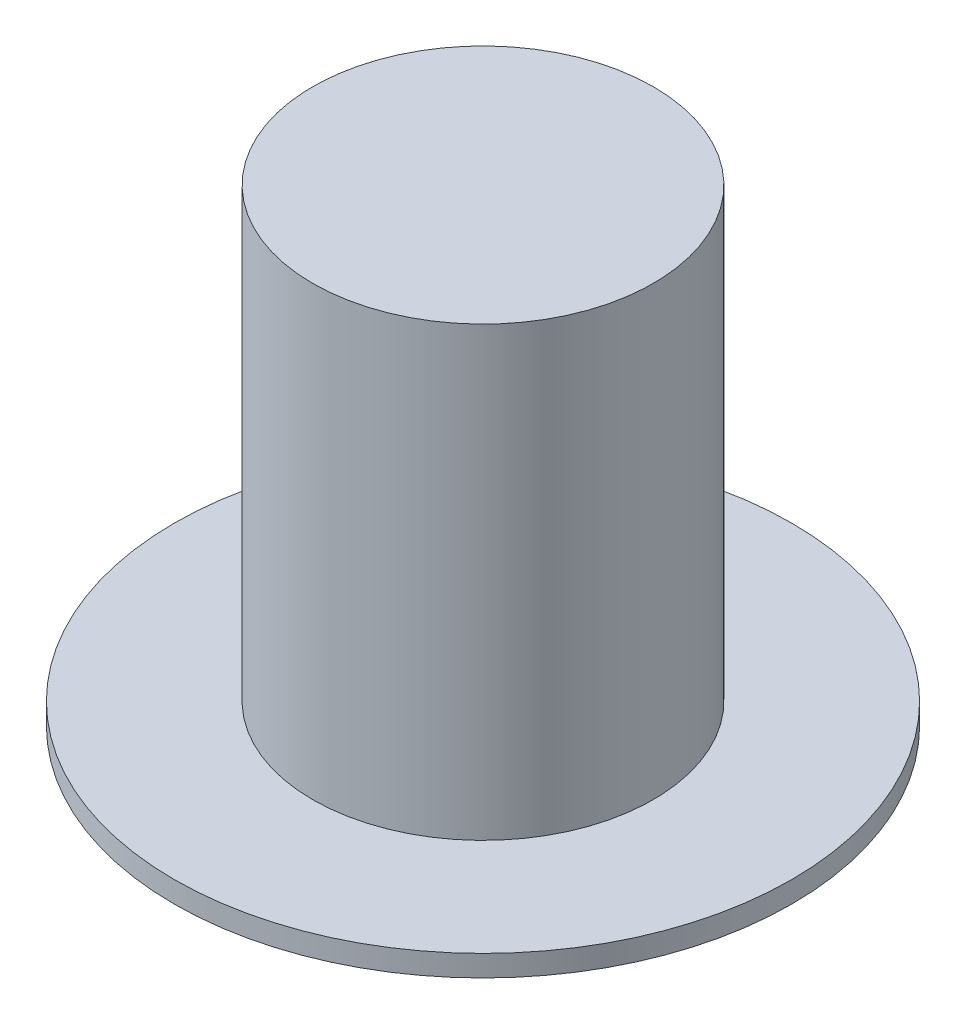
ISO-10303-21;
HEADER;
FILE_DESCRIPTION(('STEP AP214'),'2;1');
FILE_NAME('part.step','',(''),(''),'','','');
FILE_SCHEMA(('AUTOMOTIVE_DESIGN { 1 0 10303 214 1 1 1 1 }'));
ENDSEC;
DATA;
#1=APPLICATION_CONTEXT('core data for automotive mechanical design processes');
#2=APPLICATION_PROTOCOL_DEFINITION('international standard','automotive_design',2000,#1);
#3=PRODUCT_CONTEXT('',#1,'mechanical');
#4=PRODUCT('Part','Part','',(#3));
#5=PRODUCT_RELATED_PRODUCT_CATEGORY('part','',(#4));
#6=PRODUCT_DEFINITION_FORMATION('','',#4);
#7=PRODUCT_DEFINITION_CONTEXT('part definition',#1,'design');
#8=PRODUCT_DEFINITION('design','',#6,#7);
#9=PRODUCT_DEFINITION_SHAPE('','',#8);
#10=(LENGTH_UNIT() NAMED_UNIT(*) SI_UNIT(.MILLI.,.METRE.));
#11=(NAMED_UNIT(*) PLANE_ANGLE_UNIT() SI_UNIT($,.RADIAN.));
#12=(NAMED_UNIT(*) SI_UNIT($,.STERADIAN.) SOLID_ANGLE_UNIT());
#13=UNCERTAINTY_MEASURE_WITH_UNIT(LENGTH_MEASURE(1.E-05),#10,'distance_accuracy_value','');
#14=(GEOMETRIC_REPRESENTATION_CONTEXT(3) GLOBAL_UNCERTAINTY_ASSIGNED_CONTEXT((#13)) GLOBAL_UNIT_ASSIGNED_CONTEXT((#10,
#11,#12)) REPRESENTATION_CONTEXT('',''));
#15=CARTESIAN_POINT('',(0.,0.,0.));
#16=DIRECTION('',(0.,0.,1.));
#17=DIRECTION('',(1.,0.,0.));
#18=AXIS2_PLACEMENT_3D('',#15,#16,#17);
#19=CARTESIAN_POINT('',(-1.,10.,-6.5));
#20=DIRECTION('',(1.,0.,0.));
#21=DIRECTION('',(0.,0.,-1.));
#22=AXIS2_PLACEMENT_3D('',#19,#20,#21);
#23=PLANE('',#22);
#24=DIRECTION('',(0.,0.,1.));
#25=VECTOR('',#24,1.);
#26=CARTESIAN_POINT('',(-1.,10.,-6.5));
#27=LINE('',#26,#25);
#28=CARTESIAN_POINT('',(-1.,10.,-6.5));
#29=VERTEX_POINT('',#28);
#30=CARTESIAN_POINT('',(-1.,10.,-1.));
#31=VERTEX_POINT('',#30);
#32=EDGE_CURVE('E106',#29,#31,#27,.T.);
#33=ORIENTED_EDGE('',*,*,#32,.T.);
#34=DIRECTION('',(0.,1.,0.));
#35=VECTOR('',#34,1.);
#36=CARTESIAN_POINT('',(-1.,9.,-1.));
#37=LINE('',#36,#35);
#38=CARTESIAN_POINT('',(-1.,9.,-1.));
#39=VERTEX_POINT('',#38);
#40=EDGE_CURVE('E47',#39,#31,#37,.T.);
#41=ORIENTED_EDGE('',*,*,#40,.F.);
#42=DIRECTION('',(0.,0.,-1.));
#43=VECTOR('',#42,1.);
#44=CARTESIAN_POINT('',(-1.,9.,1.));
#45=LINE('',#44,#43);
#46=CARTESIAN_POINT('',(-0.999999999999999,9.,1.));
#47=VERTEX_POINT('',#46);
#48=EDGE_CURVE('E52',#47,#39,#45,.T.);
#49=ORIENTED_EDGE('',*,*,#48,.F.);
#50=DIRECTION('',(0.,1.,0.));
#51=VECTOR('',#50,1.);
#52=CARTESIAN_POINT('',(-1.,9.,1.));
#53=LINE('',#52,#51);
#54=CARTESIAN_POINT('',(-1.,10.,1.));
#55=VERTEX_POINT('',#54);
#56=EDGE_CURVE('E110',#47,#55,#53,.T.);
#57=ORIENTED_EDGE('',*,*,#56,.T.);
#58=CARTESIAN_POINT('',(-0.999999999999998,10.,6.5));
#59=VERTEX_POINT('',#58);
#60=EDGE_CURVE('E97',#55,#59,#27,.T.);
#61=ORIENTED_EDGE('',*,*,#60,.T.);
#62=DIRECTION('',(0.,-1.,0.));
#63=VECTOR('',#62,1.);
#64=CARTESIAN_POINT('',(-0.999999999999998,10.,6.5));
#65=LINE('',#64,#63);
#66=CARTESIAN_POINT('',(-0.999999999999998,0.,6.5));
#67=VERTEX_POINT('',#66);
#68=EDGE_CURVE('E159',#59,#67,#65,.T.);
#69=ORIENTED_EDGE('',*,*,#68,.T.);
#70=DIRECTION('',(0.,0.,1.));
#71=VECTOR('',#70,1.);
#72=CARTESIAN_POINT('',(-1.,0.,-6.5));
#73=LINE('',#72,#71);
#74=CARTESIAN_POINT('',(-1.,0.,-6.5));
#75=VERTEX_POINT('',#74);
#76=EDGE_CURVE('E135',#75,#67,#73,.T.);
#77=ORIENTED_EDGE('',*,*,#76,.F.);
#78=DIRECTION('',(0.,-1.,0.));
#79=VECTOR('',#78,1.);
#80=CARTESIAN_POINT('',(-1.,10.,-6.5));
#81=LINE('',#80,#79);
#82=EDGE_CURVE('E152',#29,#75,#81,.T.);
#83=ORIENTED_EDGE('',*,*,#82,.F.);
#84=EDGE_LOOP('',(#33,#41,#49,#57,#61,#69,#77,#83));
#85=FACE_BOUND('',#84,.T.);
#86=ADVANCED_FACE('F32',(#85),#23,.T.);
#87=CARTESIAN_POINT('',(0.999999999999999,10.,-6.5));
#88=DIRECTION('',(-1.,0.,0.));
#89=DIRECTION('',(0.,0.,1.));
#90=AXIS2_PLACEMENT_3D('',#87,#88,#89);
#91=PLANE('',#90);
#92=DIRECTION('',(0.,0.,1.));
#93=VECTOR('',#92,1.);
#94=CARTESIAN_POINT('',(0.999999999999998,9.,1.));
#95=LINE('',#94,#93);
#96=CARTESIAN_POINT('',(0.999999999999999,9.,-1.));
#97=VERTEX_POINT('',#96);
#98=CARTESIAN_POINT('',(0.999999999999999,9.,1.));
#99=VERTEX_POINT('',#98);
#100=EDGE_CURVE('E127',#97,#99,#95,.T.);
#101=ORIENTED_EDGE('',*,*,#100,.F.);
#102=DIRECTION('',(0.,1.,0.));
#103=VECTOR('',#102,1.);
#104=CARTESIAN_POINT('',(0.999999999999998,9.,-1.));
#105=LINE('',#104,#103);
#106=CARTESIAN_POINT('',(0.999999999999999,10.,-1.));
#107=VERTEX_POINT('',#106);
#108=EDGE_CURVE('E132',#97,#107,#105,.T.);
#109=ORIENTED_EDGE('',*,*,#108,.T.);
#110=DIRECTION('',(0.,0.,-1.));
#111=VECTOR('',#110,1.);
#112=CARTESIAN_POINT('',(0.999999999999999,10.,-6.5));
#113=LINE('',#112,#111);
#114=CARTESIAN_POINT('',(0.999999999999999,10.,-6.5));
#115=VERTEX_POINT('',#114);
#116=EDGE_CURVE('E147',#107,#115,#113,.T.);
#117=ORIENTED_EDGE('',*,*,#116,.T.);
#118=DIRECTION('',(0.,-1.,0.));
#119=VECTOR('',#118,1.);
#120=CARTESIAN_POINT('',(0.999999999999999,10.,-6.5));
#121=LINE('',#120,#119);
#122=CARTESIAN_POINT('',(0.999999999999999,0.,-6.5));
#123=VERTEX_POINT('',#122);
#124=EDGE_CURVE('E155',#115,#123,#121,.T.);
#125=ORIENTED_EDGE('',*,*,#124,.T.);
#126=DIRECTION('',(0.,0.,-1.));
#127=VECTOR('',#126,1.);
#128=CARTESIAN_POINT('',(0.999999999999999,0.,-6.5));
#129=LINE('',#128,#127);
#130=CARTESIAN_POINT('',(0.999999999999998,0.,6.5));
#131=VERTEX_POINT('',#130);
#132=EDGE_CURVE('E141',#131,#123,#129,.T.);
#133=ORIENTED_EDGE('',*,*,#132,.F.);
#134=DIRECTION('',(0.,-1.,0.));
#135=VECTOR('',#134,1.);
#136=CARTESIAN_POINT('',(0.999999999999998,10.,6.5));
#137=LINE('',#136,#135);
#138=CARTESIAN_POINT('',(0.999999999999998,10.,6.5));
#139=VERTEX_POINT('',#138);
#140=EDGE_CURVE('E157',#139,#131,#137,.T.);
#141=ORIENTED_EDGE('',*,*,#140,.F.);
#142=CARTESIAN_POINT('',(0.999999999999999,10.,0.999999999999997));
#143=VERTEX_POINT('',#142);
#144=EDGE_CURVE('E148',#139,#143,#113,.T.);
#145=ORIENTED_EDGE('',*,*,#144,.T.);
#146=DIRECTION('',(0.,1.,0.));
#147=VECTOR('',#146,1.);
#148=CARTESIAN_POINT('',(0.999999999999998,9.,1.));
#149=LINE('',#148,#147);
#150=EDGE_CURVE('E113',#99,#143,#149,.T.);
#151=ORIENTED_EDGE('',*,*,#150,.F.);
#152=EDGE_LOOP('',(#101,#109,#117,#125,#133,#141,#145,#151));
#153=FACE_BOUND('',#152,.T.);
#154=ADVANCED_FACE('F191',(#153),#91,.T.);
#155=CARTESIAN_POINT('',(-0.999999999999998,10.,6.5));
#156=DIRECTION('',(0.,1.,0.));
#157=DIRECTION('',(0.,0.,1.));
#158=AXIS2_PLACEMENT_3D('',#155,#156,#157);
#159=PLANE('',#158);
#160=DIRECTION('',(1.,0.,0.));
#161=VECTOR('',#160,1.);
#162=CARTESIAN_POINT('',(-1.,10.,-1.));
#163=LINE('',#162,#161);
#164=EDGE_CURVE('E118',#31,#107,#163,.T.);
#165=ORIENTED_EDGE('',*,*,#164,.F.);
#166=ORIENTED_EDGE('',*,*,#32,.F.);
#167=DIRECTION('',(-1.,0.,0.));
#168=VECTOR('',#167,1.);
#169=CARTESIAN_POINT('',(-1.,10.,-6.5));
#170=LINE('',#169,#168);
#171=EDGE_CURVE('E150',#115,#29,#170,.T.);
#172=ORIENTED_EDGE('',*,*,#171,.F.);
#173=ORIENTED_EDGE('',*,*,#116,.F.);
#174=EDGE_LOOP('',(#165,#166,#172,#173));
#175=FACE_BOUND('',#174,.T.);
#176=ADVANCED_FACE('F184',(#175),#159,.F.);
#177=DIRECTION('',(-1.,0.,0.));
#178=VECTOR('',#177,1.);
#179=CARTESIAN_POINT('',(-1.,10.,1.));
#180=LINE('',#179,#178);
#181=EDGE_CURVE('E101',#143,#55,#180,.T.);
#182=ORIENTED_EDGE('',*,*,#181,.F.);
#183=ORIENTED_EDGE('',*,*,#144,.F.);
#184=DIRECTION('',(1.,0.,0.));
#185=VECTOR('',#184,1.);
#186=CARTESIAN_POINT('',(-0.999999999999998,10.,6.5));
#187=LINE('',#186,#185);
#188=EDGE_CURVE('E103',#59,#139,#187,.T.);
#189=ORIENTED_EDGE('',*,*,#188,.F.);
#190=ORIENTED_EDGE('',*,*,#60,.F.);
#191=EDGE_LOOP('',(#182,#183,#189,#190));
#192=FACE_BOUND('',#191,.T.);
#193=ADVANCED_FACE('F98',(#192),#159,.F.);
#194=CARTESIAN_POINT('',(0.,0.,0.));
#195=DIRECTION('',(0.,1.,0.));
#196=DIRECTION('',(0.,0.,1.));
#197=AXIS2_PLACEMENT_3D('',#194,#195,#196);
#198=PLANE('',#197);
#199=CARTESIAN_POINT('',(0.,0.,0.));
#200=DIRECTION('',(0.,1.,0.));
#201=DIRECTION('',(0.,0.,1.));
#202=AXIS2_PLACEMENT_3D('',#199,#200,#201);
#203=CIRCLE('',#202,14.5);
#204=CARTESIAN_POINT('',(0.,0.,14.5));
#205=VERTEX_POINT('',#204);
#206=EDGE_CURVE('E40',#205,#205,#203,.T.);
#207=ORIENTED_EDGE('',*,*,#206,.F.);
#208=EDGE_LOOP('',(#207));
#209=FACE_BOUND('',#208,.T.);
#210=ORIENTED_EDGE('',*,*,#76,.T.);
#211=DIRECTION('',(1.,0.,0.));
#212=VECTOR('',#211,1.);
#213=CARTESIAN_POINT('',(-0.999999999999998,0.,6.5));
#214=LINE('',#213,#212);
#215=EDGE_CURVE('E138',#67,#131,#214,.T.);
#216=ORIENTED_EDGE('',*,*,#215,.T.);
#217=ORIENTED_EDGE('',*,*,#132,.T.);
#218=DIRECTION('',(-1.,0.,0.));
#219=VECTOR('',#218,1.);
#220=CARTESIAN_POINT('',(-1.,0.,-6.5));
#221=LINE('',#220,#219);
#222=EDGE_CURVE('E107',#123,#75,#221,.T.);
#223=ORIENTED_EDGE('',*,*,#222,.T.);
#224=EDGE_LOOP('',(#210,#216,#217,#223));
#225=FACE_BOUND('',#224,.T.);
#226=ADVANCED_FACE('F170',(#209,#225),#198,.F.);
#227=CARTESIAN_POINT('',(0.,1.,0.));
#228=DIRECTION('',(0.,1.,0.));
#229=DIRECTION('',(0.,0.,1.));
#230=AXIS2_PLACEMENT_3D('',#227,#228,#229);
#231=PLANE('',#230);
#232=CARTESIAN_POINT('',(0.,1.,0.));
#233=DIRECTION('',(0.,1.,0.));
#234=DIRECTION('',(0.,0.,1.));
#235=AXIS2_PLACEMENT_3D('',#232,#233,#234);
#236=CIRCLE('',#235,14.5);
#237=CARTESIAN_POINT('',(0.,1.,14.5));
#238=VERTEX_POINT('',#237);
#239=EDGE_CURVE('E11',#238,#238,#236,.T.);
#240=ORIENTED_EDGE('',*,*,#239,.T.);
#241=EDGE_LOOP('',(#240));
#242=FACE_BOUND('',#241,.T.);
#243=CARTESIAN_POINT('',(0.,1.,0.));
#244=DIRECTION('',(0.,1.,0.));
#245=DIRECTION('',(0.,0.,1.));
#246=AXIS2_PLACEMENT_3D('',#243,#244,#245);
#247=CIRCLE('',#246,8.);
#248=CARTESIAN_POINT('',(0.,1.,-8.));
#249=VERTEX_POINT('',#248);
#250=EDGE_CURVE('E161',#249,#249,#247,.T.);
#251=ORIENTED_EDGE('',*,*,#250,.F.);
#252=EDGE_LOOP('',(#251));
#253=FACE_BOUND('',#252,.T.);
#254=ADVANCED_FACE('F173',(#242,#253),#231,.T.);
#255=CARTESIAN_POINT('',(0.,1.,0.));
#256=DIRECTION('',(0.,-1.,0.));
#257=DIRECTION('',(0.,0.,-1.));
#258=AXIS2_PLACEMENT_3D('',#255,#256,#257);
#259=CYLINDRICAL_SURFACE('',#258,14.5);
#260=ORIENTED_EDGE('',*,*,#239,.F.);
#261=EDGE_LOOP('',(#260));
#262=FACE_BOUND('',#261,.T.);
#263=ORIENTED_EDGE('',*,*,#206,.T.);
#264=EDGE_LOOP('',(#263));
#265=FACE_BOUND('',#264,.T.);
#266=ADVANCED_FACE('F34',(#262,#265),#259,.T.);
#267=CARTESIAN_POINT('',(0.,22.,0.));
#268=DIRECTION('',(0.,-1.,0.));
#269=DIRECTION('',(0.,0.,-1.));
#270=AXIS2_PLACEMENT_3D('',#267,#268,#269);
#271=CYLINDRICAL_SURFACE('',#270,8.);
#272=CARTESIAN_POINT('',(0.,22.,0.));
#273=DIRECTION('',(0.,1.,0.));
#274=DIRECTION('',(0.,0.,1.));
#275=AXIS2_PLACEMENT_3D('',#272,#273,#274);
#276=CIRCLE('',#275,8.);
#277=CARTESIAN_POINT('',(0.,22.,-8.));
#278=VERTEX_POINT('',#277);
#279=EDGE_CURVE('E164',#278,#278,#276,.T.);
#280=CARTESIAN_POINT('',(0.,22.,-8.));
#281=CARTESIAN_POINT('',(0.,21.78125,-8.));
#282=CARTESIAN_POINT('',(0.,21.5625,-8.));
#283=CARTESIAN_POINT('',(0.,21.125,-8.));
#284=CARTESIAN_POINT('',(0.,20.90625,-8.));
#285=CARTESIAN_POINT('',(0.,20.46875,-8.));
#286=CARTESIAN_POINT('',(0.,20.25,-8.));
#287=CARTESIAN_POINT('',(0.,19.8125,-8.));
#288=CARTESIAN_POINT('',(0.,19.59375,-8.));
#289=CARTESIAN_POINT('',(0.,19.15625,-8.));
#290=CARTESIAN_POINT('',(0.,18.9375,-8.));
#291=CARTESIAN_POINT('',(0.,18.5,-8.));
#292=CARTESIAN_POINT('',(0.,18.28125,-8.));
#293=CARTESIAN_POINT('',(0.,17.84375,-8.));
#294=CARTESIAN_POINT('',(0.,17.625,-8.));
#295=CARTESIAN_POINT('',(0.,17.1875,-8.));
#296=CARTESIAN_POINT('',(0.,16.96875,-8.));
#297=CARTESIAN_POINT('',(0.,16.53125,-8.));
#298=CARTESIAN_POINT('',(0.,16.3125,-8.));
#299=CARTESIAN_POINT('',(0.,15.875,-8.));
#300=CARTESIAN_POINT('',(0.,15.65625,-8.));
#301=CARTESIAN_POINT('',(0.,15.21875,-8.));
#302=CARTESIAN_POINT('',(0.,15.,-8.));
#303=CARTESIAN_POINT('',(0.,14.5625,-8.));
#304=CARTESIAN_POINT('',(0.,14.34375,-8.));
#305=CARTESIAN_POINT('',(0.,13.90625,-8.));
#306=CARTESIAN_POINT('',(0.,13.6875,-8.));
#307=CARTESIAN_POINT('',(0.,13.25,-8.));
#308=CARTESIAN_POINT('',(0.,13.03125,-8.));
#309=CARTESIAN_POINT('',(0.,12.59375,-8.));
#310=CARTESIAN_POINT('',(0.,12.375,-8.));
#311=CARTESIAN_POINT('',(0.,11.9375,-8.));
#312=CARTESIAN_POINT('',(0.,11.71875,-8.));
#313=CARTESIAN_POINT('',(0.,11.28125,-8.));
#314=CARTESIAN_POINT('',(0.,11.0625,-8.));
#315=CARTESIAN_POINT('',(0.,10.625,-8.));
#316=CARTESIAN_POINT('',(0.,10.40625,-8.));
#317=CARTESIAN_POINT('',(0.,9.96875,-8.));
#318=CARTESIAN_POINT('',(0.,9.75,-8.));
#319=CARTESIAN_POINT('',(0.,9.3125,-8.));
#320=CARTESIAN_POINT('',(0.,9.09375,-8.));
#321=CARTESIAN_POINT('',(0.,8.65625,-8.));
#322=CARTESIAN_POINT('',(0.,8.4375,-8.));
#323=CARTESIAN_POINT('',(0.,8.,-8.));
#324=CARTESIAN_POINT('',(0.,7.78125,-8.));
#325=CARTESIAN_POINT('',(0.,7.34375,-8.));
#326=CARTESIAN_POINT('',(0.,7.125,-8.));
#327=CARTESIAN_POINT('',(0.,6.6875,-8.));
#328=CARTESIAN_POINT('',(0.,6.46875,-8.));
#329=CARTESIAN_POINT('',(0.,6.03125,-8.));
#330=CARTESIAN_POINT('',(0.,5.8125,-8.));
#331=CARTESIAN_POINT('',(0.,5.375,-8.));
#332=CARTESIAN_POINT('',(0.,5.15625,-8.));
#333=CARTESIAN_POINT('',(0.,4.71875,-8.));
#334=CARTESIAN_POINT('',(0.,4.5,-8.));
#335=CARTESIAN_POINT('',(0.,4.0625,-8.));
#336=CARTESIAN_POINT('',(0.,3.84375,-8.));
#337=CARTESIAN_POINT('',(0.,3.40625,-8.));
#338=CARTESIAN_POINT('',(0.,3.1875,-8.));
#339=CARTESIAN_POINT('',(0.,2.75,-8.));
#340=CARTESIAN_POINT('',(0.,2.53125,-8.));
#341=CARTESIAN_POINT('',(0.,2.09375,-8.));
#342=CARTESIAN_POINT('',(0.,1.875,-8.));
#343=CARTESIAN_POINT('',(0.,1.4375,-8.));
#344=CARTESIAN_POINT('',(0.,1.21875,-8.));
#345=CARTESIAN_POINT('',(0.,1.,-8.));
#346=B_SPLINE_CURVE_WITH_KNOTS('',3,(#280,#281,#282,#283,#284,#285,#286,#287,#288,#289,#290,
#291,#292,#293,#294,#295,#296,#297,#298,#299,#300,#301,#302,#303,#304,#305,#306,#307,#308,#309,
#310,#311,#312,#313,#314,#315,#316,#317,#318,#319,#320,#321,#322,#323,#324,#325,#326,#327,#328,
#329,#330,#331,#332,#333,#334,#335,#336,#337,#338,#339,#340,#341,#342,#343,#344,#345),
.UNSPECIFIED.,.F.,.F.,(4,2,2,2,2,2,2,2,2,2,2,2,2,2,2,2,2,2,2,2,2,2,2,2,2,2,2,2,2,2,2,2,4),(0.,
0.656249999999997,1.3125,1.96875,2.625,3.28125,3.9375,4.59375,5.25,5.90625,6.5625,7.21875,7.875,
8.53125,9.1875,9.84375,10.5,11.15625,11.8125,12.46875,13.125,13.78125,14.4375,15.09375,15.75,
16.40625,17.0625,17.71875,18.375,19.03125,19.6875,20.34375,21.),.UNSPECIFIED.);
#347=EDGE_CURVE('BSEAM204',#278,#249,#346,.T.);
#348=ORIENTED_EDGE('',*,*,#279,.F.);
#349=ORIENTED_EDGE('',*,*,#250,.T.);
#350=ORIENTED_EDGE('',*,*,#347,.T.);
#351=ORIENTED_EDGE('',*,*,#347,.F.);
#352=EDGE_LOOP('',(#348,#350,#349,#351));
#353=FACE_BOUND('',#352,.T.);
#354=ADVANCED_FACE('F204',(#353),#271,.T.);
#355=CARTESIAN_POINT('',(0.,22.,0.));
#356=DIRECTION('',(0.,1.,0.));
#357=DIRECTION('',(0.,0.,1.));
#358=AXIS2_PLACEMENT_3D('',#355,#356,#357);
#359=PLANE('',#358);
#360=ORIENTED_EDGE('',*,*,#279,.T.);
#361=EDGE_LOOP('',(#360));
#362=FACE_BOUND('',#361,.T.);
#363=ADVANCED_FACE('F197',(#362),#359,.T.);
#364=CARTESIAN_POINT('',(-0.999999999999998,10.,6.5));
#365=DIRECTION('',(0.,0.,-1.));
#366=DIRECTION('',(-1.,0.,0.));
#367=AXIS2_PLACEMENT_3D('',#364,#365,#366);
#368=PLANE('',#367);
#369=ORIENTED_EDGE('',*,*,#215,.F.);
#370=ORIENTED_EDGE('',*,*,#68,.F.);
#371=ORIENTED_EDGE('',*,*,#188,.T.);
#372=ORIENTED_EDGE('',*,*,#140,.T.);
#373=EDGE_LOOP('',(#369,#370,#371,#372));
#374=FACE_BOUND('',#373,.T.);
#375=ADVANCED_FACE('F195',(#374),#368,.T.);
#376=CARTESIAN_POINT('',(-1.,10.,-6.5));
#377=DIRECTION('',(0.,0.,1.));
#378=DIRECTION('',(1.,0.,0.));
#379=AXIS2_PLACEMENT_3D('',#376,#377,#378);
#380=PLANE('',#379);
#381=ORIENTED_EDGE('',*,*,#222,.F.);
#382=ORIENTED_EDGE('',*,*,#124,.F.);
#383=ORIENTED_EDGE('',*,*,#171,.T.);
#384=ORIENTED_EDGE('',*,*,#82,.T.);
#385=EDGE_LOOP('',(#381,#382,#383,#384));
#386=FACE_BOUND('',#385,.T.);
#387=ADVANCED_FACE('F179',(#386),#380,.T.);
#388=CARTESIAN_POINT('',(-1.,9.,-1.));
#389=DIRECTION('',(0.,0.,1.));
#390=DIRECTION('',(1.,0.,0.));
#391=AXIS2_PLACEMENT_3D('',#388,#389,#390);
#392=PLANE('',#391);
#393=ORIENTED_EDGE('',*,*,#164,.T.);
#394=ORIENTED_EDGE('',*,*,#108,.F.);
#395=DIRECTION('',(1.,0.,0.));
#396=VECTOR('',#395,1.);
#397=CARTESIAN_POINT('',(-1.,9.,-1.));
#398=LINE('',#397,#396);
#399=EDGE_CURVE('E120',#39,#97,#398,.T.);
#400=ORIENTED_EDGE('',*,*,#399,.F.);
#401=ORIENTED_EDGE('',*,*,#40,.T.);
#402=EDGE_LOOP('',(#393,#394,#400,#401));
#403=FACE_BOUND('',#402,.T.);
#404=ADVANCED_FACE('F186',(#403),#392,.F.);
#405=CARTESIAN_POINT('',(-1.,9.,1.));
#406=DIRECTION('',(0.,0.,-1.));
#407=DIRECTION('',(-1.,0.,0.));
#408=AXIS2_PLACEMENT_3D('',#405,#406,#407);
#409=PLANE('',#408);
#410=ORIENTED_EDGE('',*,*,#181,.T.);
#411=ORIENTED_EDGE('',*,*,#56,.F.);
#412=DIRECTION('',(-1.,0.,0.));
#413=VECTOR('',#412,1.);
#414=CARTESIAN_POINT('',(-1.,9.,1.));
#415=LINE('',#414,#413);
#416=EDGE_CURVE('E114',#99,#47,#415,.T.);
#417=ORIENTED_EDGE('',*,*,#416,.F.);
#418=ORIENTED_EDGE('',*,*,#150,.T.);
#419=EDGE_LOOP('',(#410,#411,#417,#418));
#420=FACE_BOUND('',#419,.T.);
#421=ADVANCED_FACE('F117',(#420),#409,.F.);
#422=CARTESIAN_POINT('',(-1.,9.,-1.));
#423=DIRECTION('',(0.,-1.,0.));
#424=DIRECTION('',(0.,0.,-1.));
#425=AXIS2_PLACEMENT_3D('',#422,#423,#424);
#426=PLANE('',#425);
#427=ORIENTED_EDGE('',*,*,#48,.T.);
#428=ORIENTED_EDGE('',*,*,#399,.T.);
#429=ORIENTED_EDGE('',*,*,#100,.T.);
#430=ORIENTED_EDGE('',*,*,#416,.T.);
#431=EDGE_LOOP('',(#427,#428,#429,#430));
#432=FACE_BOUND('',#431,.T.);
#433=ADVANCED_FACE('F189',(#432),#426,.T.);
#434=CLOSED_SHELL('',(#86,#154,#176,#193,#226,#254,#266,#354,#363,#375,#387,#404,#421,#433));
#435=MANIFOLD_SOLID_BREP('B2',#434);
#436=ADVANCED_BREP_SHAPE_REPRESENTATION('',(#18,#435),#14);
#437=SHAPE_DEFINITION_REPRESENTATION(#9,#436);
ENDSEC;
END-ISO-10303-21;
